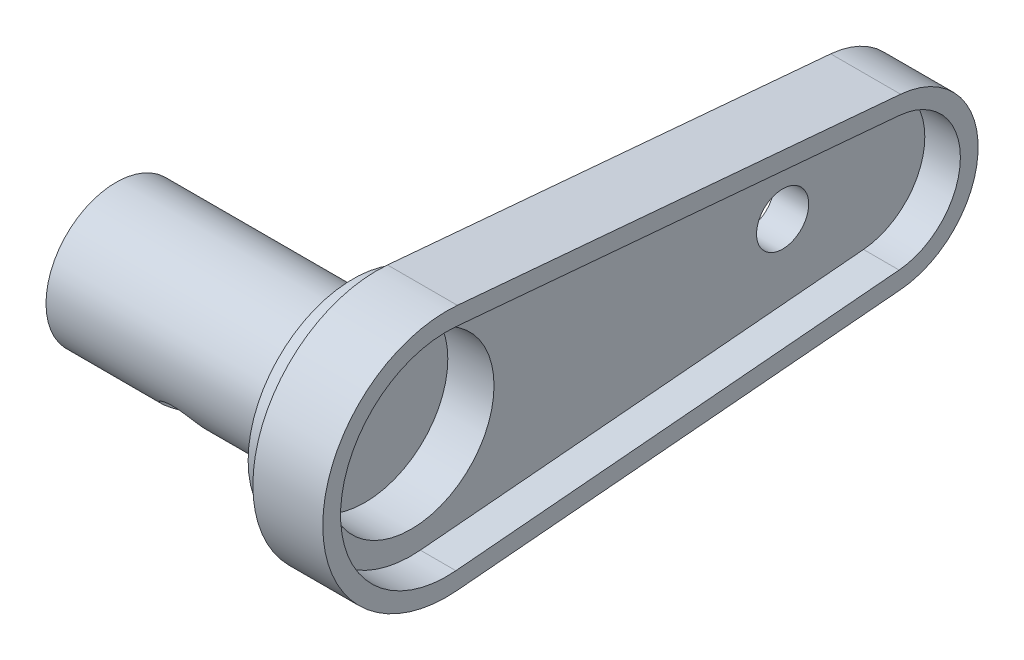
ISO-10303-21;
HEADER;
FILE_DESCRIPTION(('STEP AP214'),'2;1');
FILE_NAME('part.step','',(''),(''),'','','');
FILE_SCHEMA(('AUTOMOTIVE_DESIGN { 1 0 10303 214 1 1 1 1 }'));
ENDSEC;
DATA;
#1=APPLICATION_CONTEXT('core data for automotive mechanical design processes');
#2=APPLICATION_PROTOCOL_DEFINITION('international standard','automotive_design',2000,#1);
#3=PRODUCT_CONTEXT('',#1,'mechanical');
#4=PRODUCT('Part','Part','',(#3));
#5=PRODUCT_RELATED_PRODUCT_CATEGORY('part','',(#4));
#6=PRODUCT_DEFINITION_FORMATION('','',#4);
#7=PRODUCT_DEFINITION_CONTEXT('part definition',#1,'design');
#8=PRODUCT_DEFINITION('design','',#6,#7);
#9=PRODUCT_DEFINITION_SHAPE('','',#8);
#10=(LENGTH_UNIT() NAMED_UNIT(*) SI_UNIT(.MILLI.,.METRE.));
#11=(NAMED_UNIT(*) PLANE_ANGLE_UNIT() SI_UNIT($,.RADIAN.));
#12=(NAMED_UNIT(*) SI_UNIT($,.STERADIAN.) SOLID_ANGLE_UNIT());
#13=UNCERTAINTY_MEASURE_WITH_UNIT(LENGTH_MEASURE(1.E-05),#10,'distance_accuracy_value','');
#14=(GEOMETRIC_REPRESENTATION_CONTEXT(3) GLOBAL_UNCERTAINTY_ASSIGNED_CONTEXT((#13)) GLOBAL_UNIT_ASSIGNED_CONTEXT((#10,
#11,#12)) REPRESENTATION_CONTEXT('',''));
#15=CARTESIAN_POINT('',(0.,0.,0.));
#16=DIRECTION('',(0.,0.,1.));
#17=DIRECTION('',(1.,0.,0.));
#18=AXIS2_PLACEMENT_3D('',#15,#16,#17);
#19=CARTESIAN_POINT('',(-0.769895912398936,0.00828195020726651,-7.25858189969561));
#20=DIRECTION('',(1.,0.,0.));
#21=DIRECTION('',(0.,0.,-1.));
#22=AXIS2_PLACEMENT_3D('',#19,#20,#21);
#23=PLANE('',#22);
#24=CARTESIAN_POINT('',(-0.769895912398936,0.00828195020726885,-16.8140618996956));
#25=DIRECTION('',(1.,0.,0.));
#26=DIRECTION('',(0.,0.,-1.));
#27=AXIS2_PLACEMENT_3D('',#24,#25,#26);
#28=CIRCLE('',#27,0.670560000000001);
#29=CARTESIAN_POINT('',(-0.769895912398936,0.00828195020726885,-17.4846218996956));
#30=VERTEX_POINT('',#29);
#31=EDGE_CURVE('E388',#30,#30,#28,.T.);
#32=ORIENTED_EDGE('',*,*,#31,.T.);
#33=EDGE_LOOP('',(#32));
#34=FACE_BOUND('',#33,.T.);
#35=CARTESIAN_POINT('',(-0.769895912398936,0.00828195020726651,-7.25858189969561));
#36=DIRECTION('',(1.,0.,0.));
#37=DIRECTION('',(0.,0.,-1.));
#38=AXIS2_PLACEMENT_3D('',#35,#36,#37);
#39=CIRCLE('',#38,3.18516);
#40=CARTESIAN_POINT('',(-0.769895912398936,3.18132145478117,-7.53618688526571));
#41=VERTEX_POINT('',#40);
#42=CARTESIAN_POINT('',(-0.769895912398936,-3.16475755436664,-7.53618688526571));
#43=VERTEX_POINT('',#42);
#44=EDGE_CURVE('E166',#41,#43,#39,.T.);
#45=ORIENTED_EDGE('',*,*,#44,.F.);
#46=DIRECTION('',(0.,0.0871557427476513,0.996194698091746));
#47=VECTOR('',#46,1.);
#48=CARTESIAN_POINT('',(-0.769895912398936,2.18404181690554,-18.935145306664));
#49=LINE('',#48,#47);
#50=CARTESIAN_POINT('',(-0.769895912398936,2.18404181690554,-18.935145306664));
#51=VERTEX_POINT('',#50);
#52=EDGE_CURVE('E87',#51,#41,#49,.T.);
#53=ORIENTED_EDGE('',*,*,#52,.F.);
#54=CARTESIAN_POINT('',(-0.769895912398936,0.00828195020726794,-18.7447909837732));
#55=DIRECTION('',(1.,0.,0.));
#56=DIRECTION('',(0.,0.,-1.));
#57=AXIS2_PLACEMENT_3D('',#54,#55,#56);
#58=CIRCLE('',#57,2.1840709159224);
#59=CARTESIAN_POINT('',(-0.769895912398936,-2.16747791649101,-18.935145306664));
#60=VERTEX_POINT('',#59);
#61=EDGE_CURVE('E178',#60,#51,#58,.T.);
#62=ORIENTED_EDGE('',*,*,#61,.F.);
#63=DIRECTION('',(0.,0.0871557427476515,-0.996194698091746));
#64=VECTOR('',#63,1.);
#65=CARTESIAN_POINT('',(-0.769895912398936,-2.16747791649101,-18.935145306664));
#66=LINE('',#65,#64);
#67=EDGE_CURVE('E176',#43,#60,#66,.T.);
#68=ORIENTED_EDGE('',*,*,#67,.F.);
#69=EDGE_LOOP('',(#45,#53,#62,#68));
#70=FACE_BOUND('',#69,.T.);
#71=CARTESIAN_POINT('',(-0.769895912398936,0.00828195020726651,-7.25858189969561));
#72=DIRECTION('',(1.,0.,0.));
#73=DIRECTION('',(0.,0.,-1.));
#74=AXIS2_PLACEMENT_3D('',#71,#72,#73);
#75=CIRCLE('',#74,2.69748);
#76=CARTESIAN_POINT('',(-0.769895912398936,0.00828195020726651,-9.95606189969561));
#77=VERTEX_POINT('',#76);
#78=EDGE_CURVE('E11',#77,#77,#75,.F.);
#79=ORIENTED_EDGE('',*,*,#78,.F.);
#80=EDGE_LOOP('',(#79));
#81=FACE_BOUND('',#80,.T.);
#82=ADVANCED_FACE('F35',(#34,#70,#81),#23,.F.);
#83=CARTESIAN_POINT('',(1.02842408760106,0.00828195020726651,-7.25858189969561));
#84=DIRECTION('',(-1.,0.,0.));
#85=DIRECTION('',(0.,0.,1.));
#86=AXIS2_PLACEMENT_3D('',#83,#84,#85);
#87=CYLINDRICAL_SURFACE('',#86,3.18516);
#88=ORIENTED_EDGE('',*,*,#44,.T.);
#89=DIRECTION('',(-1.,0.,0.));
#90=VECTOR('',#89,1.);
#91=CARTESIAN_POINT('',(1.02842408760106,-3.16475755436664,-7.53618688526571));
#92=LINE('',#91,#90);
#93=CARTESIAN_POINT('',(1.02842408760106,-3.16475755436664,-7.53618688526571));
#94=VERTEX_POINT('',#93);
#95=EDGE_CURVE('E49',#94,#43,#92,.T.);
#96=ORIENTED_EDGE('',*,*,#95,.F.);
#97=CARTESIAN_POINT('',(1.02842408760106,0.00828195020726651,-7.25858189969561));
#98=DIRECTION('',(1.,0.,0.));
#99=DIRECTION('',(0.,0.,-1.));
#100=AXIS2_PLACEMENT_3D('',#97,#98,#99);
#101=CIRCLE('',#100,3.18516);
#102=CARTESIAN_POINT('',(1.02842408760106,3.18132145478117,-7.53618688526571));
#103=VERTEX_POINT('',#102);
#104=EDGE_CURVE('E167',#103,#94,#101,.T.);
#105=ORIENTED_EDGE('',*,*,#104,.F.);
#106=DIRECTION('',(-1.,0.,0.));
#107=VECTOR('',#106,1.);
#108=CARTESIAN_POINT('',(1.02842408760106,3.18132145478117,-7.53618688526571));
#109=LINE('',#108,#107);
#110=EDGE_CURVE('E173',#103,#41,#109,.T.);
#111=ORIENTED_EDGE('',*,*,#110,.T.);
#112=EDGE_LOOP('',(#88,#96,#105,#111));
#113=FACE_BOUND('',#112,.T.);
#114=ADVANCED_FACE('F37',(#113),#87,.T.);
#115=CARTESIAN_POINT('',(1.02842408760106,-2.16747791649101,-18.935145306664));
#116=DIRECTION('',(0.,0.996194698091746,0.0871557427476515));
#117=DIRECTION('',(0.,-0.0871557427476515,0.996194698091746));
#118=AXIS2_PLACEMENT_3D('',#115,#116,#117);
#119=PLANE('',#118);
#120=ORIENTED_EDGE('',*,*,#67,.T.);
#121=DIRECTION('',(-1.,0.,0.));
#122=VECTOR('',#121,1.);
#123=CARTESIAN_POINT('',(1.02842408760106,-2.16747791649101,-18.935145306664));
#124=LINE('',#123,#122);
#125=CARTESIAN_POINT('',(1.02842408760106,-2.16747791649101,-18.935145306664));
#126=VERTEX_POINT('',#125);
#127=EDGE_CURVE('E184',#126,#60,#124,.T.);
#128=ORIENTED_EDGE('',*,*,#127,.F.);
#129=DIRECTION('',(0.,0.0871557427476515,-0.996194698091746));
#130=VECTOR('',#129,1.);
#131=CARTESIAN_POINT('',(1.02842408760106,-2.16747791649101,-18.935145306664));
#132=LINE('',#131,#130);
#133=EDGE_CURVE('E95',#94,#126,#132,.T.);
#134=ORIENTED_EDGE('',*,*,#133,.F.);
#135=ORIENTED_EDGE('',*,*,#95,.T.);
#136=EDGE_LOOP('',(#120,#128,#134,#135));
#137=FACE_BOUND('',#136,.T.);
#138=ADVANCED_FACE('F252',(#137),#119,.F.);
#139=CARTESIAN_POINT('',(1.02842408760106,0.00828195020726794,-18.7447909837732));
#140=DIRECTION('',(-1.,0.,0.));
#141=DIRECTION('',(0.,0.,1.));
#142=AXIS2_PLACEMENT_3D('',#139,#140,#141);
#143=CYLINDRICAL_SURFACE('',#142,2.1840709159224);
#144=ORIENTED_EDGE('',*,*,#61,.T.);
#145=DIRECTION('',(-1.,0.,0.));
#146=VECTOR('',#145,1.);
#147=CARTESIAN_POINT('',(1.02842408760106,2.18404181690554,-18.935145306664));
#148=LINE('',#147,#146);
#149=CARTESIAN_POINT('',(1.02842408760106,2.18404181690554,-18.935145306664));
#150=VERTEX_POINT('',#149);
#151=EDGE_CURVE('E182',#150,#51,#148,.T.);
#152=ORIENTED_EDGE('',*,*,#151,.F.);
#153=CARTESIAN_POINT('',(1.02842408760106,0.00828195020726794,-18.7447909837732));
#154=DIRECTION('',(1.,0.,0.));
#155=DIRECTION('',(0.,0.,-1.));
#156=AXIS2_PLACEMENT_3D('',#153,#154,#155);
#157=CIRCLE('',#156,2.1840709159224);
#158=EDGE_CURVE('E170',#126,#150,#157,.T.);
#159=ORIENTED_EDGE('',*,*,#158,.F.);
#160=ORIENTED_EDGE('',*,*,#127,.T.);
#161=EDGE_LOOP('',(#144,#152,#159,#160));
#162=FACE_BOUND('',#161,.T.);
#163=ADVANCED_FACE('F260',(#162),#143,.T.);
#164=CARTESIAN_POINT('',(1.02842408760106,2.18404181690554,-18.935145306664));
#165=DIRECTION('',(0.,-0.996194698091746,0.0871557427476513));
#166=DIRECTION('',(0.,-0.0871557427476513,-0.996194698091746));
#167=AXIS2_PLACEMENT_3D('',#164,#165,#166);
#168=PLANE('',#167);
#169=ORIENTED_EDGE('',*,*,#52,.T.);
#170=ORIENTED_EDGE('',*,*,#110,.F.);
#171=DIRECTION('',(0.,0.0871557427476513,0.996194698091746));
#172=VECTOR('',#171,1.);
#173=CARTESIAN_POINT('',(1.02842408760106,2.18404181690554,-18.935145306664));
#174=LINE('',#173,#172);
#175=EDGE_CURVE('E66',#150,#103,#174,.T.);
#176=ORIENTED_EDGE('',*,*,#175,.F.);
#177=ORIENTED_EDGE('',*,*,#151,.T.);
#178=EDGE_LOOP('',(#169,#170,#176,#177));
#179=FACE_BOUND('',#178,.T.);
#180=ADVANCED_FACE('F257',(#179),#168,.F.);
#181=CARTESIAN_POINT('',(1.02842408760106,0.00828195020726651,-7.25858189969561));
#182=DIRECTION('',(1.,0.,0.));
#183=DIRECTION('',(0.,0.,-1.));
#184=AXIS2_PLACEMENT_3D('',#181,#182,#183);
#185=PLANE('',#184);
#186=CARTESIAN_POINT('',(1.02842408760106,0.00828195020726794,-18.7447909837732));
#187=DIRECTION('',(1.,0.,0.));
#188=DIRECTION('',(0.,0.,-1.));
#189=AXIS2_PLACEMENT_3D('',#186,#187,#188);
#190=CIRCLE('',#189,1.7268709159224);
#191=CARTESIAN_POINT('',(1.02842408760106,-1.71201770052346,-18.8952977010797));
#192=VERTEX_POINT('',#191);
#193=CARTESIAN_POINT('',(1.02842408760106,1.728581600938,-18.8952977010797));
#194=VERTEX_POINT('',#193);
#195=EDGE_CURVE('E57',#192,#194,#190,.T.);
#196=ORIENTED_EDGE('',*,*,#195,.F.);
#197=DIRECTION('',(0.,0.0871557427476516,-0.996194698091746));
#198=VECTOR('',#197,1.);
#199=CARTESIAN_POINT('',(1.02842408760106,-2.70929733839909,-7.49633927968149));
#200=LINE('',#199,#198);
#201=CARTESIAN_POINT('',(1.02842408760106,-2.70929733839909,-7.49633927968149));
#202=VERTEX_POINT('',#201);
#203=EDGE_CURVE('E137',#202,#192,#200,.T.);
#204=ORIENTED_EDGE('',*,*,#203,.F.);
#205=CARTESIAN_POINT('',(1.02842408760106,0.00828195020726651,-7.25858189969561));
#206=DIRECTION('',(1.,0.,0.));
#207=DIRECTION('',(0.,0.,-1.));
#208=AXIS2_PLACEMENT_3D('',#205,#206,#207);
#209=CIRCLE('',#208,2.72796);
#210=CARTESIAN_POINT('',(1.02842408760106,2.72586123881363,-7.49633927968149));
#211=VERTEX_POINT('',#210);
#212=EDGE_CURVE('E140',#211,#202,#209,.T.);
#213=ORIENTED_EDGE('',*,*,#212,.F.);
#214=DIRECTION('',(0.,0.0871557427476513,0.996194698091746));
#215=VECTOR('',#214,1.);
#216=CARTESIAN_POINT('',(1.02842408760106,1.728581600938,-18.8952977010797));
#217=LINE('',#216,#215);
#218=EDGE_CURVE('E149',#194,#211,#217,.T.);
#219=ORIENTED_EDGE('',*,*,#218,.F.);
#220=EDGE_LOOP('',(#196,#204,#213,#219));
#221=FACE_BOUND('',#220,.T.);
#222=ORIENTED_EDGE('',*,*,#104,.T.);
#223=ORIENTED_EDGE('',*,*,#133,.T.);
#224=ORIENTED_EDGE('',*,*,#158,.T.);
#225=ORIENTED_EDGE('',*,*,#175,.T.);
#226=EDGE_LOOP('',(#222,#223,#224,#225));
#227=FACE_BOUND('',#226,.T.);
#228=ADVANCED_FACE('F235',(#221,#227),#185,.T.);
#229=CARTESIAN_POINT('',(-1.37949591239894,0.00828195020726651,-7.25858189969561));
#230=DIRECTION('',(-1.,0.,0.));
#231=DIRECTION('',(0.,0.,1.));
#232=AXIS2_PLACEMENT_3D('',#229,#230,#231);
#233=PLANE('',#232);
#234=CARTESIAN_POINT('',(-1.37949591239894,0.00828195020726651,-7.25858189969561));
#235=DIRECTION('',(-1.,0.,0.));
#236=DIRECTION('',(0.,0.,1.));
#237=AXIS2_PLACEMENT_3D('',#234,#235,#236);
#238=CIRCLE('',#237,2.69748);
#239=CARTESIAN_POINT('',(-1.37949591239894,0.00828195020726651,-4.56110189969561));
#240=VERTEX_POINT('',#239);
#241=EDGE_CURVE('E156',#240,#240,#238,.T.);
#242=ORIENTED_EDGE('',*,*,#241,.T.);
#243=EDGE_LOOP('',(#242));
#244=FACE_BOUND('',#243,.T.);
#245=CARTESIAN_POINT('',(-1.37949591239894,0.00828195020726651,-7.25858189969561));
#246=DIRECTION('',(-1.,0.,0.));
#247=DIRECTION('',(0.,0.,1.));
#248=AXIS2_PLACEMENT_3D('',#245,#246,#247);
#249=CIRCLE('',#248,1.8);
#250=CARTESIAN_POINT('',(-1.37949591239894,0.00828195020726651,-5.45858189969561));
#251=VERTEX_POINT('',#250);
#252=EDGE_CURVE('E162',#251,#251,#249,.T.);
#253=ORIENTED_EDGE('',*,*,#252,.F.);
#254=EDGE_LOOP('',(#253));
#255=FACE_BOUND('',#254,.T.);
#256=ADVANCED_FACE('F231',(#244,#255),#233,.T.);
#257=CARTESIAN_POINT('',(-1.37949591239894,0.00828195020726651,-7.25858189969561));
#258=DIRECTION('',(1.,0.,0.));
#259=DIRECTION('',(0.,0.,-1.));
#260=AXIS2_PLACEMENT_3D('',#257,#258,#259);
#261=CYLINDRICAL_SURFACE('',#260,2.69748);
#262=ORIENTED_EDGE('',*,*,#241,.F.);
#263=EDGE_LOOP('',(#262));
#264=FACE_BOUND('',#263,.T.);
#265=ORIENTED_EDGE('',*,*,#78,.T.);
#266=EDGE_LOOP('',(#265));
#267=FACE_BOUND('',#266,.T.);
#268=ADVANCED_FACE('F234',(#264,#267),#261,.T.);
#269=CARTESIAN_POINT('',(-7.47549591239894,0.00828195020726651,-7.25858189969561));
#270=DIRECTION('',(-1.,0.,0.));
#271=DIRECTION('',(0.,0.,1.));
#272=AXIS2_PLACEMENT_3D('',#269,#270,#271);
#273=PLANE('',#272);
#274=CARTESIAN_POINT('',(-7.47549591239894,0.00828195020726651,-7.25858189969561));
#275=DIRECTION('',(-1.,0.,0.));
#276=DIRECTION('',(0.,0.,1.));
#277=AXIS2_PLACEMENT_3D('',#274,#275,#276);
#278=CIRCLE('',#277,1.8);
#279=CARTESIAN_POINT('',(-7.47549591239894,0.00828195020726651,-5.45858189969561));
#280=VERTEX_POINT('',#279);
#281=EDGE_CURVE('E163',#280,#280,#278,.T.);
#282=ORIENTED_EDGE('',*,*,#281,.T.);
#283=EDGE_LOOP('',(#282));
#284=FACE_BOUND('',#283,.T.);
#285=ADVANCED_FACE('F238',(#284),#273,.T.);
#286=CARTESIAN_POINT('',(-7.47549591239894,0.00828195020726651,-7.25858189969561));
#287=DIRECTION('',(1.,0.,0.));
#288=DIRECTION('',(0.,0.,-1.));
#289=AXIS2_PLACEMENT_3D('',#286,#287,#288);
#290=CYLINDRICAL_SURFACE('',#289,1.8);
#291=CARTESIAN_POINT('',(-4.9516506401568,0.00828195020726651,-9.05858189969561));
#292=CARTESIAN_POINT('',(-4.93261471981272,-0.0262204873853149,-9.05858046977169));
#293=CARTESIAN_POINT('',(-4.91093077355014,-0.0592983051521689,-9.05758278533246));
#294=CARTESIAN_POINT('',(-4.86260125418652,-0.121636519108466,-9.05415946822551));
#295=CARTESIAN_POINT('',(-4.83594591094382,-0.15088920191343,-9.05173100303961));
#296=CARTESIAN_POINT('',(-4.78293829246701,-0.199714552512792,-9.04666283421123));
#297=CARTESIAN_POINT('',(-4.75731430111613,-0.220087099991683,-9.04413034342762));
#298=CARTESIAN_POINT('',(-4.70310281079119,-0.256381367031593,-9.03911240704551));
#299=CARTESIAN_POINT('',(-4.67452151124569,-0.272312148731581,-9.03662687544949));
#300=CARTESIAN_POINT('',(-4.62023375622119,-0.296287480138292,-9.03266149287255));
#301=CARTESIAN_POINT('',(-4.5949357498132,-0.305235361456656,-9.03108115229684));
#302=CARTESIAN_POINT('',(-4.54317298786424,-0.318830679656216,-9.02862315979299));
#303=CARTESIAN_POINT('',(-4.51670915710938,-0.323481463060833,-9.02774496111786));
#304=CARTESIAN_POINT('',(-4.46326393618699,-0.328112203646058,-9.02687067113424));
#305=CARTESIAN_POINT('',(-4.43628110705377,-0.328076431888246,-9.02687755030789));
#306=CARTESIAN_POINT('',(-4.38275213550387,-0.32329758546577,-9.02777956182888));
#307=CARTESIAN_POINT('',(-4.35620610754308,-0.318553296375488,-9.02867492333447));
#308=CARTESIAN_POINT('',(-4.3055065172471,-0.305069732234387,-9.03110950633595));
#309=CARTESIAN_POINT('',(-4.28129906292168,-0.296523255412193,-9.03261738120803));
#310=CARTESIAN_POINT('',(-4.2344067386517,-0.276024123877604,-9.03601764853975));
#311=CARTESIAN_POINT('',(-4.21172290980214,-0.264069168823244,-9.03791030043254));
#312=CARTESIAN_POINT('',(-4.15909184152648,-0.231728217157698,-9.04261092623321));
#313=CARTESIAN_POINT('',(-4.1300327266203,-0.209901729306834,-9.04547303949991));
#314=CARTESIAN_POINT('',(-4.07581807210723,-0.16179193299734,-9.05069286498431));
#315=CARTESIAN_POINT('',(-4.05066854774295,-0.1355018844654,-9.05304980201418));
#316=CARTESIAN_POINT('',(-4.00419754036663,-0.07909205962309,-9.05668496761096));
#317=CARTESIAN_POINT('',(-3.98293030252595,-0.0489267782767458,-9.0579487160625));
#318=CARTESIAN_POINT('',(-3.94490520572718,0.0141377982777127,-9.05884879856237));
#319=CARTESIAN_POINT('',(-3.92814710986795,0.0470369497349468,-9.05848521812493));
#320=CARTESIAN_POINT('',(-3.89781284021818,0.118864930404247,-9.05558193701639));
#321=CARTESIAN_POINT('',(-3.88484951876307,0.1580461812828,-9.052789333361));
#322=CARTESIAN_POINT('',(-3.86572941876446,0.237759240016455,-9.04434316288701));
#323=CARTESIAN_POINT('',(-3.85957081886455,0.278290683484524,-9.03869036222157));
#324=CARTESIAN_POINT('',(-3.85492509168394,0.356529409899635,-9.02498823038874));
#325=CARTESIAN_POINT('',(-3.85594009912337,0.394239456312023,-9.01713017467688));
#326=CARTESIAN_POINT('',(-3.86488562564601,0.468290700597805,-8.99922511698002));
#327=CARTESIAN_POINT('',(-3.87280981097711,0.504633120374647,-8.98918012611907));
#328=CARTESIAN_POINT('',(-3.89432510090845,0.570633829095157,-8.96879226325553));
#329=CARTESIAN_POINT('',(-3.90717815564835,0.600584077688266,-8.95861011411116));
#330=CARTESIAN_POINT('',(-3.93810775481663,0.657448783569327,-8.93771849639354));
#331=CARTESIAN_POINT('',(-3.95618307912326,0.684363947929117,-8.9270091514777));
#332=CARTESIAN_POINT('',(-3.99608662491408,0.733252085303363,-8.90633533279229));
#333=CARTESIAN_POINT('',(-4.0176976301332,0.755398283708802,-8.89635955059116));
#334=CARTESIAN_POINT('',(-4.06461225067756,0.795827691995262,-8.87730732964493));
#335=CARTESIAN_POINT('',(-4.08991595747088,0.81411080616038,-8.86823091318644));
#336=CARTESIAN_POINT('',(-4.14381551239968,0.846678282338134,-8.85151365790261));
#337=CARTESIAN_POINT('',(-4.17244464518565,0.86091623195281,-8.8438897881491));
#338=CARTESIAN_POINT('',(-4.23197329683608,0.884914389722306,-8.83074714777331));
#339=CARTESIAN_POINT('',(-4.2628729966603,0.89467424053137,-8.8252285451542));
#340=CARTESIAN_POINT('',(-4.32662488792242,0.909714558676811,-8.81662438743172));
#341=CARTESIAN_POINT('',(-4.35950102421667,0.914917728415428,-8.81358087801288));
#342=CARTESIAN_POINT('',(-4.42579857112669,0.92050121214567,-8.810312125018));
#343=CARTESIAN_POINT('',(-4.45921999512335,0.920881407606943,-8.81008695070591));
#344=CARTESIAN_POINT('',(-4.52577761819411,0.916807445129716,-8.81247600292996));
#345=CARTESIAN_POINT('',(-4.55891248392897,0.912337061593625,-8.81509975940186));
#346=CARTESIAN_POINT('',(-4.62384306504149,0.898590671668369,-8.82300275082415));
#347=CARTESIAN_POINT('',(-4.65563872707096,0.88931447403139,-8.82828209145351));
#348=CARTESIAN_POINT('',(-4.7169819522844,0.866079161009021,-8.84109857138257));
#349=CARTESIAN_POINT('',(-4.74652975678059,0.852120549163382,-8.8486354678988));
#350=CARTESIAN_POINT('',(-4.80253007831979,0.819728200088158,-8.86540682002768));
#351=CARTESIAN_POINT('',(-4.82898276163886,0.801294703422013,-8.87464118438041));
#352=CARTESIAN_POINT('',(-4.87783012625255,0.760440320049817,-8.89405244768981));
#353=CARTESIAN_POINT('',(-4.90025460621751,0.738051370131972,-8.90422150582024));
#354=CARTESIAN_POINT('',(-4.94064627835884,0.689672451174722,-8.92483415169414));
#355=CARTESIAN_POINT('',(-4.95861434430213,0.6636831896066,-8.93527768517653));
#356=CARTESIAN_POINT('',(-4.98931633652683,0.609295485616911,-8.95552247216843));
#357=CARTESIAN_POINT('',(-5.00214554857482,0.580953944206818,-8.96533228169863));
#358=CARTESIAN_POINT('',(-5.02282180002057,0.522204156582866,-8.98393190149697));
#359=CARTESIAN_POINT('',(-5.0306694520426,0.491796165007107,-8.99272183707888));
#360=CARTESIAN_POINT('',(-5.04138973530175,0.429638103615209,-9.00886582148319));
#361=CARTESIAN_POINT('',(-5.04424454813086,0.397883639617217,-9.01621464480269));
#362=CARTESIAN_POINT('',(-5.04511139971124,0.333948516947552,-9.02917694250751));
#363=CARTESIAN_POINT('',(-5.04312005031562,0.301767575750858,-9.03478919969795));
#364=CARTESIAN_POINT('',(-5.03431976104444,0.23563058420802,-9.04449985359286));
#365=CARTESIAN_POINT('',(-5.02720033736317,0.201698209072931,-9.04847329544418));
#366=CARTESIAN_POINT('',(-5.00824780540652,0.135050613942001,-9.05442356958276));
#367=CARTESIAN_POINT('',(-4.99642107402208,0.102333812523457,-9.05640309023662));
#368=CARTESIAN_POINT('',(-4.97312448459036,0.0493557217056879,-9.05823902723774));
#369=CARTESIAN_POINT('',(-4.9628454718319,0.0285724838010273,-9.05858274061936));
#370=CARTESIAN_POINT('',(-4.9516506401568,0.00828195020726651,-9.05858189969561));
#371=B_SPLINE_CURVE_WITH_KNOTS('',3,(#291,#292,#293,#294,#295,#296,#297,#298,#299,#300,#301,
#302,#303,#304,#305,#306,#307,#308,#309,#310,#311,#312,#313,#314,#315,#316,#317,#318,#319,#320,
#321,#322,#323,#324,#325,#326,#327,#328,#329,#330,#331,#332,#333,#334,#335,#336,#337,#338,#339,
#340,#341,#342,#343,#344,#345,#346,#347,#348,#349,#350,#351,#352,#353,#354,#355,#356,#357,#358,
#359,#360,#361,#362,#363,#364,#365,#366,#367,#368,#369,#370),.UNSPECIFIED.,.T.,.F.,(4,2,2,2,2,2,
2,2,2,2,2,2,2,2,2,2,2,2,2,2,2,2,2,2,2,2,2,2,2,2,2,2,2,2,2,2,2,2,2,4),(0.,0.118150635274657,
0.23653596318501,0.334668272841309,0.432598881920491,0.512903475322237,0.593145475716661,
0.673656789853203,0.754188874948398,0.831034843897277,0.907932798554183,1.01671490634797,
1.12566276270071,1.23603253932188,1.34639651620684,1.46984592362411,1.59326228047824,
1.70820170939049,1.82303588216955,1.92494765036405,2.02683562730308,2.12391802723353,
2.22100283229927,2.31916028714474,2.41732557345028,2.51712552044214,2.6169279201321,
2.71706519942851,2.8172064640033,2.91733696298831,3.01746208029178,3.11681293027329,
3.21614428515528,3.31353753041867,3.41091879609547,3.50864689153084,3.60644333223415,
3.71072004549752,3.81485597546855,3.88433916568465),.UNSPECIFIED.);
#372=CARTESIAN_POINT('',(-4.9516506401568,0.00828195020726651,-9.05858189969561));
#373=VERTEX_POINT('',#372);
#374=EDGE_CURVE('E39',#373,#373,#371,.T.);
#375=ORIENTED_EDGE('',*,*,#374,.T.);
#376=EDGE_LOOP('',(#375));
#377=FACE_BOUND('',#376,.T.);
#378=CARTESIAN_POINT('',(-4.45037604596551,-0.879814420158503,-5.69292394313448));
#379=CARTESIAN_POINT('',(-4.41705555457713,-0.879817147581583,-5.69292416834884));
#380=CARTESIAN_POINT('',(-4.38368187912458,-0.882265969609534,-5.69430661662236));
#381=CARTESIAN_POINT('',(-4.31781982973513,-0.891972025716958,-5.699873261261));
#382=CARTESIAN_POINT('',(-4.28533398845609,-0.899241768968961,-5.70406474672684));
#383=CARTESIAN_POINT('',(-4.22225320491387,-0.9182695776678,-5.71533082551316));
#384=CARTESIAN_POINT('',(-4.19165667194546,-0.930023805840197,-5.7224029542799));
#385=CARTESIAN_POINT('',(-4.13322552454716,-0.957500448658745,-5.73952790801792));
#386=CARTESIAN_POINT('',(-4.10538925943374,-0.973220471516657,-5.74957893703779));
#387=CARTESIAN_POINT('',(-4.05336873669672,-1.00787647242538,-5.77269735717643));
#388=CARTESIAN_POINT('',(-4.0291701412144,-1.02679916428983,-5.78575236371973));
#389=CARTESIAN_POINT('',(-3.98499702960827,-1.06708021011443,-5.81490167457291));
#390=CARTESIAN_POINT('',(-3.96502216179554,-1.08843836105781,-5.83099572562517));
#391=CARTESIAN_POINT('',(-3.93018484242694,-1.13224501978873,-5.8657558838288));
#392=CARTESIAN_POINT('',(-3.91523401793032,-1.15466577477134,-5.88436844308321));
#393=CARTESIAN_POINT('',(-3.89027892952032,-1.2000361415641,-5.92408746742508));
#394=CARTESIAN_POINT('',(-3.88027411155528,-1.22298569383679,-5.94519365284821));
#395=CARTESIAN_POINT('',(-3.86536049809089,-1.26842764107977,-5.98932611037957));
#396=CARTESIAN_POINT('',(-3.86042447975685,-1.29092183532496,-6.0123414002627));
#397=CARTESIAN_POINT('',(-3.85544464425792,-1.33487152637287,-6.05983812519409));
#398=CARTESIAN_POINT('',(-3.85540195813955,-1.35632678188942,-6.08431989789737));
#399=CARTESIAN_POINT('',(-3.8600641590398,-1.39873592585228,-6.13543477059365));
#400=CARTESIAN_POINT('',(-3.86501386453933,-1.41960697204665,-6.16211371612073));
#401=CARTESIAN_POINT('',(-3.87963358368592,-1.45923026619341,-6.21573892134782));
#402=CARTESIAN_POINT('',(-3.88930505637545,-1.47798185701963,-6.24268526115056));
#403=CARTESIAN_POINT('',(-3.91422896624964,-1.51503883884728,-6.29902620644088));
#404=CARTESIAN_POINT('',(-3.92996482391621,-1.53308560432769,-6.32837708959187));
#405=CARTESIAN_POINT('',(-3.96629669407389,-1.56627566964947,-6.38573088305436));
#406=CARTESIAN_POINT('',(-3.98689900566644,-1.58141515989865,-6.41373198918338));
#407=CARTESIAN_POINT('',(-4.03465630588007,-1.60999029663296,-6.46974292243198));
#408=CARTESIAN_POINT('',(-4.0622288526046,-1.62315806669243,-6.49753589014269));
#409=CARTESIAN_POINT('',(-4.12243015868498,-1.64606413051796,-6.54870652173902));
#410=CARTESIAN_POINT('',(-4.15504932430056,-1.65580881900706,-6.5720923803178));
#411=CARTESIAN_POINT('',(-4.21411674051431,-1.66938713193214,-6.60616018454608));
#412=CARTESIAN_POINT('',(-4.23938231951751,-1.67411701080985,-6.61853780022224));
#413=CARTESIAN_POINT('',(-4.29173571552727,-1.68188278730032,-6.63933488988882));
#414=CARTESIAN_POINT('',(-4.3188211218178,-1.6849208783005,-6.64775948668991));
#415=CARTESIAN_POINT('',(-4.37438226504809,-1.68926950320263,-6.6599476468903));
#416=CARTESIAN_POINT('',(-4.40286654882657,-1.69056754626438,-6.66367749778364));
#417=CARTESIAN_POINT('',(-4.46006544985406,-1.69135971121825,-6.66594352371471));
#418=CARTESIAN_POINT('',(-4.48877999112996,-1.69085440551284,-6.66448134675916));
#419=CARTESIAN_POINT('',(-4.54239812513337,-1.68820508068673,-6.65696406538327));
#420=CARTESIAN_POINT('',(-4.56738387826351,-1.6862397984168,-6.65141043064432));
#421=CARTESIAN_POINT('',(-4.61613432442981,-1.68091677454862,-6.63675550157553));
#422=CARTESIAN_POINT('',(-4.6398981815398,-1.67755809357414,-6.62765181418475));
#423=CARTESIAN_POINT('',(-4.69323506632649,-1.66817832825805,-6.60306368470686));
#424=CARTESIAN_POINT('',(-4.72220537645008,-1.66164770474159,-6.58646804687538));
#425=CARTESIAN_POINT('',(-4.77688236314274,-1.64626049812568,-6.54943356389864));
#426=CARTESIAN_POINT('',(-4.80258441630589,-1.63740067318208,-6.52898937358629));
#427=CARTESIAN_POINT('',(-4.85085132563366,-1.61721223726758,-6.48504356445048));
#428=CARTESIAN_POINT('',(-4.87336506155363,-1.60584956242035,-6.46150176731645));
#429=CARTESIAN_POINT('',(-4.91462402889819,-1.58071239574608,-6.41249900408271));
#430=CARTESIAN_POINT('',(-4.93336908292627,-1.56693779044356,-6.38703794771863));
#431=CARTESIAN_POINT('',(-4.96989127689115,-1.53424317707298,-6.33021039565926));
#432=CARTESIAN_POINT('',(-4.98688105230367,-1.51484316150294,-6.29860831994266));
#433=CARTESIAN_POINT('',(-5.01471977232102,-1.47274977339737,-6.23486152407164));
#434=CARTESIAN_POINT('',(-5.02556701696964,-1.45005549134881,-6.20271665623081));
#435=CARTESIAN_POINT('',(-5.04029647805293,-1.40217958496202,-6.13959243313931));
#436=CARTESIAN_POINT('',(-5.04430120249994,-1.37705041370832,-6.10860251309246));
#437=CARTESIAN_POINT('',(-5.04510262711746,-1.32471660089044,-6.04833310955931));
#438=CARTESIAN_POINT('',(-5.04190680950617,-1.29751414210025,-6.01905188297716));
#439=CARTESIAN_POINT('',(-5.02877504046937,-1.24536983979694,-5.96646310547249));
#440=CARTESIAN_POINT('',(-5.01965143567791,-1.22052509891823,-5.94285532677969));
#441=CARTESIAN_POINT('',(-4.99554505769007,-1.17117577732858,-5.89844211430383));
#442=CARTESIAN_POINT('',(-4.98056462910031,-1.14667106455714,-5.87763556360701));
#443=CARTESIAN_POINT('',(-4.94645546354223,-1.10095161954327,-5.84069564114772));
#444=CARTESIAN_POINT('',(-4.92772365265634,-1.07962807189853,-5.82432844593236));
#445=CARTESIAN_POINT('',(-4.88607035523273,-1.03915392247176,-5.79450861015301));
#446=CARTESIAN_POINT('',(-4.86314954279697,-1.02000297187382,-5.78105550140883));
#447=CARTESIAN_POINT('',(-4.81385080023787,-0.984741951689415,-5.75713017898486));
#448=CARTESIAN_POINT('',(-4.78748583558728,-0.96862100470866,-5.74664723116047));
#449=CARTESIAN_POINT('',(-4.73194188559577,-0.939989785100794,-5.72852669092788));
#450=CARTESIAN_POINT('',(-4.70276101681224,-0.927481951783063,-5.72089101978514));
#451=CARTESIAN_POINT('',(-4.64178716421404,-0.906396555517634,-5.70825351372115));
#452=CARTESIAN_POINT('',(-4.60995316108952,-0.897903989009298,-5.70330833046422));
#453=CARTESIAN_POINT('',(-4.54514667997622,-0.885618682820953,-5.69621399890543));
#454=CARTESIAN_POINT('',(-4.512177271593,-0.881814158921681,-5.69405783922042));
#455=CARTESIAN_POINT('',(-4.46954857903594,-0.880015408237105,-5.69303827354242));
#456=CARTESIAN_POINT('',(-4.459964514551,-0.879813635301815,-5.69292387832569));
#457=CARTESIAN_POINT('',(-4.45037604596551,-0.879814420158503,-5.69292394313448));
#458=B_SPLINE_CURVE_WITH_KNOTS('',3,(#378,#379,#380,#381,#382,#383,#384,#385,#386,#387,#388,
#389,#390,#391,#392,#393,#394,#395,#396,#397,#398,#399,#400,#401,#402,#403,#404,#405,#406,#407,
#408,#409,#410,#411,#412,#413,#414,#415,#416,#417,#418,#419,#420,#421,#422,#423,#424,#425,#426,
#427,#428,#429,#430,#431,#432,#433,#434,#435,#436,#437,#438,#439,#440,#441,#442,#443,#444,#445,
#446,#447,#448,#449,#450,#451,#452,#453,#454,#455,#456,#457),.UNSPECIFIED.,.T.,.F.,(4,2,2,2,2,2,
2,2,2,2,2,2,2,2,2,2,2,2,2,2,2,2,2,2,2,2,2,2,2,2,2,2,2,2,2,2,2,2,2,4),(0.,0.0999361570288158,
0.200132645181499,0.300243589012262,0.400294299232867,0.499939692748906,0.599576786015573,
0.697356238680015,0.795124735606683,0.892365359997716,0.98962846057544,1.09190481188088,
1.19421278695654,1.3073801021818,1.42069471088934,1.54399910003659,1.66707190136978,
1.75233632988523,1.83748995493812,1.92325163466394,2.00898609512325,2.08566435061017,
2.16239438387027,2.26390677200506,2.36556120273545,2.46869556462893,2.571834780048,
2.69361644318925,2.81543179316927,2.93504238414993,3.05452874285174,3.16035465018474,
3.26613823654434,3.36396262801557,3.46177129124129,3.5592218294878,3.65673800624415,
3.75623502691407,3.85548143074327,3.88423955111601),.UNSPECIFIED.);
#459=CARTESIAN_POINT('',(-4.45037604596551,-0.879814420158503,-5.69292394313448));
#460=VERTEX_POINT('',#459);
#461=EDGE_CURVE('E189',#460,#460,#458,.T.);
#462=ORIENTED_EDGE('',*,*,#461,.T.);
#463=EDGE_LOOP('',(#462));
#464=FACE_BOUND('',#463,.T.);
#465=ORIENTED_EDGE('',*,*,#252,.T.);
#466=EDGE_LOOP('',(#465));
#467=FACE_BOUND('',#466,.T.);
#468=ORIENTED_EDGE('',*,*,#281,.F.);
#469=EDGE_LOOP('',(#468));
#470=FACE_BOUND('',#469,.T.);
#471=ADVANCED_FACE('F194',(#377,#464,#467,#470),#290,.T.);
#472=CARTESIAN_POINT('',(0.114024087601064,0.00828195020726794,-18.7447909837732));
#473=DIRECTION('',(1.,0.,0.));
#474=DIRECTION('',(0.,0.,-1.));
#475=AXIS2_PLACEMENT_3D('',#472,#473,#474);
#476=CYLINDRICAL_SURFACE('',#475,1.7268709159224);
#477=ORIENTED_EDGE('',*,*,#195,.T.);
#478=DIRECTION('',(1.,0.,0.));
#479=VECTOR('',#478,1.);
#480=CARTESIAN_POINT('',(0.114024087601064,1.728581600938,-18.8952977010797));
#481=LINE('',#480,#479);
#482=CARTESIAN_POINT('',(0.114024087601064,1.728581600938,-18.8952977010797));
#483=VERTEX_POINT('',#482);
#484=EDGE_CURVE('E115',#483,#194,#481,.T.);
#485=ORIENTED_EDGE('',*,*,#484,.F.);
#486=CARTESIAN_POINT('',(0.114024087601064,0.00828195020726794,-18.7447909837732));
#487=DIRECTION('',(1.,0.,0.));
#488=DIRECTION('',(0.,0.,-1.));
#489=AXIS2_PLACEMENT_3D('',#486,#487,#488);
#490=CIRCLE('',#489,1.7268709159224);
#491=CARTESIAN_POINT('',(0.114024087601064,-1.71201770052346,-18.8952977010797));
#492=VERTEX_POINT('',#491);
#493=EDGE_CURVE('E119',#492,#483,#490,.T.);
#494=ORIENTED_EDGE('',*,*,#493,.F.);
#495=DIRECTION('',(1.,0.,0.));
#496=VECTOR('',#495,1.);
#497=CARTESIAN_POINT('',(0.114024087601064,-1.71201770052346,-18.8952977010797));
#498=LINE('',#497,#496);
#499=EDGE_CURVE('E154',#492,#192,#498,.T.);
#500=ORIENTED_EDGE('',*,*,#499,.T.);
#501=EDGE_LOOP('',(#477,#485,#494,#500));
#502=FACE_BOUND('',#501,.T.);
#503=ADVANCED_FACE('F117',(#502),#476,.F.);
#504=CARTESIAN_POINT('',(0.114024087601064,-2.70929733839909,-7.49633927968149));
#505=DIRECTION('',(0.,-0.996194698091746,-0.0871557427476516));
#506=DIRECTION('',(0.,0.0871557427476516,-0.996194698091746));
#507=AXIS2_PLACEMENT_3D('',#504,#505,#506);
#508=PLANE('',#507);
#509=ORIENTED_EDGE('',*,*,#203,.T.);
#510=ORIENTED_EDGE('',*,*,#499,.F.);
#511=DIRECTION('',(0.,0.0871557427476516,-0.996194698091746));
#512=VECTOR('',#511,1.);
#513=CARTESIAN_POINT('',(0.114024087601064,-2.70929733839909,-7.49633927968149));
#514=LINE('',#513,#512);
#515=CARTESIAN_POINT('',(0.114024087601064,-2.70929733839909,-7.49633927968149));
#516=VERTEX_POINT('',#515);
#517=EDGE_CURVE('E125',#516,#492,#514,.T.);
#518=ORIENTED_EDGE('',*,*,#517,.F.);
#519=DIRECTION('',(1.,0.,0.));
#520=VECTOR('',#519,1.);
#521=CARTESIAN_POINT('',(0.114024087601064,-2.70929733839909,-7.49633927968149));
#522=LINE('',#521,#520);
#523=EDGE_CURVE('E157',#516,#202,#522,.T.);
#524=ORIENTED_EDGE('',*,*,#523,.T.);
#525=EDGE_LOOP('',(#509,#510,#518,#524));
#526=FACE_BOUND('',#525,.T.);
#527=ADVANCED_FACE('F219',(#526),#508,.F.);
#528=CARTESIAN_POINT('',(0.114024087601064,0.00828195020726651,-7.25858189969561));
#529=DIRECTION('',(1.,0.,0.));
#530=DIRECTION('',(0.,0.,-1.));
#531=AXIS2_PLACEMENT_3D('',#528,#529,#530);
#532=CYLINDRICAL_SURFACE('',#531,2.72796);
#533=ORIENTED_EDGE('',*,*,#212,.T.);
#534=ORIENTED_EDGE('',*,*,#523,.F.);
#535=CARTESIAN_POINT('',(0.114024087601064,0.00828195020726651,-7.25858189969561));
#536=DIRECTION('',(1.,0.,0.));
#537=DIRECTION('',(0.,0.,-1.));
#538=AXIS2_PLACEMENT_3D('',#535,#536,#537);
#539=CIRCLE('',#538,2.72796);
#540=CARTESIAN_POINT('',(0.114024087601064,2.72586123881363,-7.49633927968149));
#541=VERTEX_POINT('',#540);
#542=EDGE_CURVE('E133',#541,#516,#539,.T.);
#543=ORIENTED_EDGE('',*,*,#542,.F.);
#544=DIRECTION('',(1.,0.,0.));
#545=VECTOR('',#544,1.);
#546=CARTESIAN_POINT('',(0.114024087601064,2.72586123881363,-7.49633927968149));
#547=LINE('',#546,#545);
#548=EDGE_CURVE('E124',#541,#211,#547,.T.);
#549=ORIENTED_EDGE('',*,*,#548,.T.);
#550=EDGE_LOOP('',(#533,#534,#543,#549));
#551=FACE_BOUND('',#550,.T.);
#552=ADVANCED_FACE('F222',(#551),#532,.F.);
#553=CARTESIAN_POINT('',(0.114024087601064,1.728581600938,-18.8952977010797));
#554=DIRECTION('',(0.,0.996194698091746,-0.0871557427476513));
#555=DIRECTION('',(0.,0.0871557427476513,0.996194698091746));
#556=AXIS2_PLACEMENT_3D('',#553,#554,#555);
#557=PLANE('',#556);
#558=ORIENTED_EDGE('',*,*,#218,.T.);
#559=ORIENTED_EDGE('',*,*,#548,.F.);
#560=DIRECTION('',(0.,0.0871557427476513,0.996194698091746));
#561=VECTOR('',#560,1.);
#562=CARTESIAN_POINT('',(0.114024087601064,1.728581600938,-18.8952977010797));
#563=LINE('',#562,#561);
#564=EDGE_CURVE('E128',#483,#541,#563,.T.);
#565=ORIENTED_EDGE('',*,*,#564,.F.);
#566=ORIENTED_EDGE('',*,*,#484,.T.);
#567=EDGE_LOOP('',(#558,#559,#565,#566));
#568=FACE_BOUND('',#567,.T.);
#569=ADVANCED_FACE('F129',(#568),#557,.F.);
#570=CARTESIAN_POINT('',(0.114024087601064,0.00828195020726794,-18.7447909837732));
#571=DIRECTION('',(1.,0.,0.));
#572=DIRECTION('',(0.,0.,-1.));
#573=AXIS2_PLACEMENT_3D('',#570,#571,#572);
#574=PLANE('',#573);
#575=CARTESIAN_POINT('',(0.114024087601064,0.00828195020726885,-16.8140618996956));
#576=DIRECTION('',(1.,0.,0.));
#577=DIRECTION('',(0.,0.,-1.));
#578=AXIS2_PLACEMENT_3D('',#575,#576,#577);
#579=CIRCLE('',#578,0.670560000000001);
#580=CARTESIAN_POINT('',(0.114024087601064,0.00828195020726885,-17.4846218996956));
#581=VERTEX_POINT('',#580);
#582=EDGE_CURVE('E390',#581,#581,#579,.T.);
#583=ORIENTED_EDGE('',*,*,#582,.F.);
#584=EDGE_LOOP('',(#583));
#585=FACE_BOUND('',#584,.T.);
#586=CARTESIAN_POINT('',(0.114024087601064,0.00828195020726651,-7.25858189969561));
#587=DIRECTION('',(1.,0.,0.));
#588=DIRECTION('',(0.,0.,-1.));
#589=AXIS2_PLACEMENT_3D('',#586,#587,#588);
#590=CIRCLE('',#589,2.1336);
#591=CARTESIAN_POINT('',(0.114024087601064,0.00828195020726651,-9.39218189969561));
#592=VERTEX_POINT('',#591);
#593=EDGE_CURVE('E143',#592,#592,#590,.T.);
#594=ORIENTED_EDGE('',*,*,#593,.F.);
#595=EDGE_LOOP('',(#594));
#596=FACE_BOUND('',#595,.T.);
#597=ORIENTED_EDGE('',*,*,#493,.T.);
#598=ORIENTED_EDGE('',*,*,#564,.T.);
#599=ORIENTED_EDGE('',*,*,#542,.T.);
#600=ORIENTED_EDGE('',*,*,#517,.T.);
#601=EDGE_LOOP('',(#597,#598,#599,#600));
#602=FACE_BOUND('',#601,.T.);
#603=ADVANCED_FACE('F135',(#585,#596,#602),#574,.T.);
#604=CARTESIAN_POINT('',(-1.07469591239894,0.00828195020726651,-7.25858189969561));
#605=DIRECTION('',(1.,0.,0.));
#606=DIRECTION('',(0.,0.,-1.));
#607=AXIS2_PLACEMENT_3D('',#604,#605,#606);
#608=CYLINDRICAL_SURFACE('',#607,2.1336);
#609=CARTESIAN_POINT('',(-1.07469591239894,0.00828195020726651,-7.25858189969561));
#610=DIRECTION('',(1.,0.,0.));
#611=DIRECTION('',(0.,0.,-1.));
#612=AXIS2_PLACEMENT_3D('',#609,#610,#611);
#613=CIRCLE('',#612,2.1336);
#614=CARTESIAN_POINT('',(-1.07469591239894,0.00828195020726651,-9.39218189969561));
#615=VERTEX_POINT('',#614);
#616=EDGE_CURVE('E150',#615,#615,#613,.T.);
#617=ORIENTED_EDGE('',*,*,#616,.F.);
#618=EDGE_LOOP('',(#617));
#619=FACE_BOUND('',#618,.T.);
#620=ORIENTED_EDGE('',*,*,#593,.T.);
#621=EDGE_LOOP('',(#620));
#622=FACE_BOUND('',#621,.T.);
#623=ADVANCED_FACE('F211',(#619,#622),#608,.F.);
#624=CARTESIAN_POINT('',(-1.07469591239894,0.00828195020726651,-7.25858189969561));
#625=DIRECTION('',(1.,0.,0.));
#626=DIRECTION('',(0.,0.,-1.));
#627=AXIS2_PLACEMENT_3D('',#624,#625,#626);
#628=PLANE('',#627);
#629=ORIENTED_EDGE('',*,*,#616,.T.);
#630=EDGE_LOOP('',(#629));
#631=FACE_BOUND('',#630,.T.);
#632=ADVANCED_FACE('F207',(#631),#628,.T.);
#633=CARTESIAN_POINT('',(-7.47549591239894,0.00828195020726885,-16.8140618996956));
#634=DIRECTION('',(1.,0.,0.));
#635=DIRECTION('',(0.,0.,-1.));
#636=AXIS2_PLACEMENT_3D('',#633,#634,#635);
#637=CYLINDRICAL_SURFACE('',#636,0.670560000000001);
#638=ORIENTED_EDGE('',*,*,#582,.T.);
#639=EDGE_LOOP('',(#638));
#640=FACE_BOUND('',#639,.T.);
#641=ORIENTED_EDGE('',*,*,#31,.F.);
#642=EDGE_LOOP('',(#641));
#643=FACE_BOUND('',#642,.T.);
#644=ADVANCED_FACE('F202',(#640,#643),#637,.F.);
#645=CARTESIAN_POINT('',(-4.45037604596551,-1.95572791021933,-5.0181071138004));
#646=DIRECTION('',(0.,0.500000000000004,-0.866025403784436));
#647=DIRECTION('',(0.,0.866025403784436,0.500000000000005));
#648=AXIS2_PLACEMENT_3D('',#645,#646,#647);
#649=CYLINDRICAL_SURFACE('',#648,0.594360000000001);
#650=ORIENTED_EDGE('',*,*,#461,.F.);
#651=EDGE_LOOP('',(#650));
#652=FACE_BOUND('',#651,.T.);
#653=ORIENTED_EDGE('',*,*,#374,.F.);
#654=EDGE_LOOP('',(#653));
#655=FACE_BOUND('',#654,.T.);
#656=ADVANCED_FACE('F198',(#652,#655),#649,.F.);
#657=CLOSED_SHELL('',(#82,#114,#138,#163,#180,#228,#256,#268,#285,#471,#503,#527,#552,#569,#603,
#623,#632,#644,#656));
#658=MANIFOLD_SOLID_BREP('B2',#657);
#659=ADVANCED_BREP_SHAPE_REPRESENTATION('',(#18,#658),#14);
#660=SHAPE_DEFINITION_REPRESENTATION(#9,#659);
ENDSEC;
END-ISO-10303-21;
